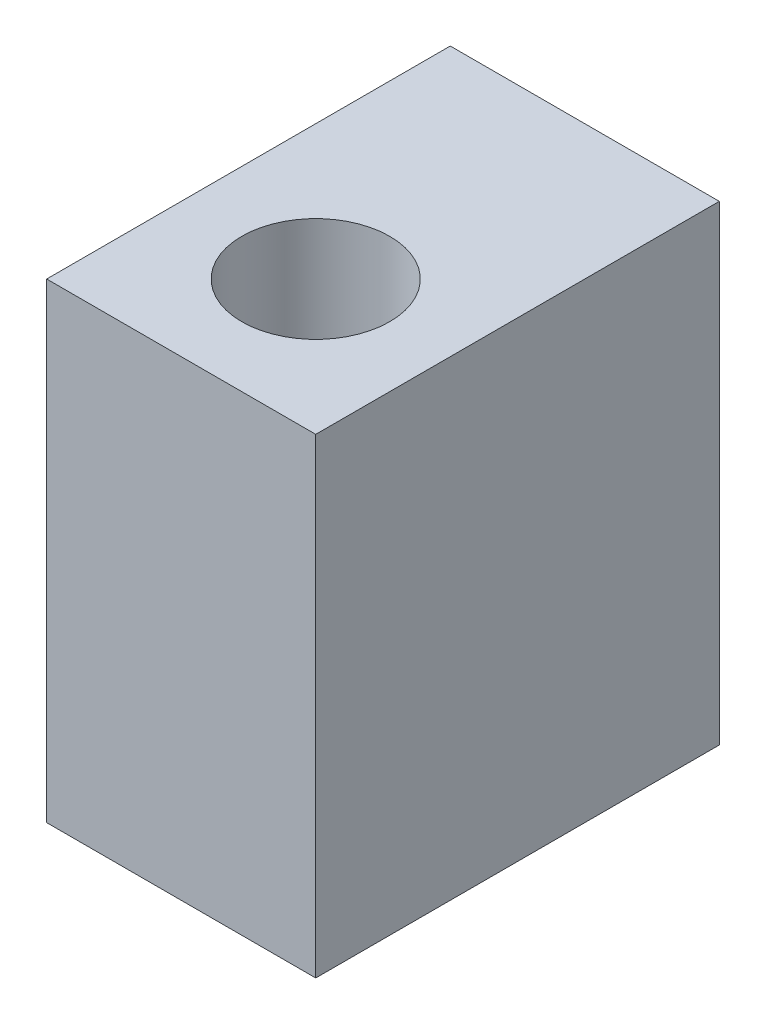
ISO-10303-21;
HEADER;
FILE_DESCRIPTION(('STEP AP214'),'2;1');
FILE_NAME('part.step','',(''),(''),'','','');
FILE_SCHEMA(('AUTOMOTIVE_DESIGN { 1 0 10303 214 1 1 1 1 }'));
ENDSEC;
DATA;
#1=APPLICATION_CONTEXT('core data for automotive mechanical design processes');
#2=APPLICATION_PROTOCOL_DEFINITION('international standard','automotive_design',2000,#1);
#3=PRODUCT_CONTEXT('',#1,'mechanical');
#4=PRODUCT('Part','Part','',(#3));
#5=PRODUCT_RELATED_PRODUCT_CATEGORY('part','',(#4));
#6=PRODUCT_DEFINITION_FORMATION('','',#4);
#7=PRODUCT_DEFINITION_CONTEXT('part definition',#1,'design');
#8=PRODUCT_DEFINITION('design','',#6,#7);
#9=PRODUCT_DEFINITION_SHAPE('','',#8);
#10=(LENGTH_UNIT() NAMED_UNIT(*) SI_UNIT(.MILLI.,.METRE.));
#11=(NAMED_UNIT(*) PLANE_ANGLE_UNIT() SI_UNIT($,.RADIAN.));
#12=(NAMED_UNIT(*) SI_UNIT($,.STERADIAN.) SOLID_ANGLE_UNIT());
#13=UNCERTAINTY_MEASURE_WITH_UNIT(LENGTH_MEASURE(1.E-05),#10,'distance_accuracy_value','');
#14=(GEOMETRIC_REPRESENTATION_CONTEXT(3) GLOBAL_UNCERTAINTY_ASSIGNED_CONTEXT((#13)) GLOBAL_UNIT_ASSIGNED_CONTEXT((#10,
#11,#12)) REPRESENTATION_CONTEXT('',''));
#15=CARTESIAN_POINT('',(0.,0.,0.));
#16=DIRECTION('',(0.,0.,1.));
#17=DIRECTION('',(1.,0.,0.));
#18=AXIS2_PLACEMENT_3D('',#15,#16,#17);
#19=CARTESIAN_POINT('',(-1.1875,7.,-0.9921875));
#20=DIRECTION('',(1.,0.,0.));
#21=DIRECTION('',(0.,0.,-1.));
#22=AXIS2_PLACEMENT_3D('',#19,#20,#21);
#23=PLANE('',#22);
#24=DIRECTION('',(0.,0.,1.));
#25=VECTOR('',#24,1.);
#26=CARTESIAN_POINT('',(-1.1875,0.,-0.9921875));
#27=LINE('',#26,#25);
#28=CARTESIAN_POINT('',(-1.1875,0.,-0.9921875));
#29=VERTEX_POINT('',#28);
#30=CARTESIAN_POINT('',(-1.1875,0.,5.0078125));
#31=VERTEX_POINT('',#30);
#32=EDGE_CURVE('E107',#29,#31,#27,.T.);
#33=ORIENTED_EDGE('',*,*,#32,.T.);
#34=DIRECTION('',(0.,-1.,0.));
#35=VECTOR('',#34,1.);
#36=CARTESIAN_POINT('',(-1.1875,7.,5.0078125));
#37=LINE('',#36,#35);
#38=CARTESIAN_POINT('',(-1.1875,7.,5.0078125));
#39=VERTEX_POINT('',#38);
#40=EDGE_CURVE('E11',#39,#31,#37,.T.);
#41=ORIENTED_EDGE('',*,*,#40,.F.);
#42=DIRECTION('',(0.,0.,1.));
#43=VECTOR('',#42,1.);
#44=CARTESIAN_POINT('',(-1.1875,7.,-0.9921875));
#45=LINE('',#44,#43);
#46=CARTESIAN_POINT('',(-1.1875,7.,-0.9921875));
#47=VERTEX_POINT('',#46);
#48=EDGE_CURVE('E91',#47,#39,#45,.T.);
#49=ORIENTED_EDGE('',*,*,#48,.F.);
#50=DIRECTION('',(0.,-1.,0.));
#51=VECTOR('',#50,1.);
#52=CARTESIAN_POINT('',(-1.1875,7.,-0.9921875));
#53=LINE('',#52,#51);
#54=EDGE_CURVE('E103',#47,#29,#53,.T.);
#55=ORIENTED_EDGE('',*,*,#54,.T.);
#56=EDGE_LOOP('',(#33,#41,#49,#55));
#57=FACE_BOUND('',#56,.T.);
#58=ADVANCED_FACE('F39',(#57),#23,.F.);
#59=CARTESIAN_POINT('',(-1.1875,7.,5.0078125));
#60=DIRECTION('',(0.,0.,-1.));
#61=DIRECTION('',(-1.,0.,0.));
#62=AXIS2_PLACEMENT_3D('',#59,#60,#61);
#63=PLANE('',#62);
#64=DIRECTION('',(1.,0.,0.));
#65=VECTOR('',#64,1.);
#66=CARTESIAN_POINT('',(-1.1875,0.,5.0078125));
#67=LINE('',#66,#65);
#68=CARTESIAN_POINT('',(2.8125,0.,5.0078125));
#69=VERTEX_POINT('',#68);
#70=EDGE_CURVE('E96',#31,#69,#67,.T.);
#71=ORIENTED_EDGE('',*,*,#70,.T.);
#72=DIRECTION('',(0.,-1.,0.));
#73=VECTOR('',#72,1.);
#74=CARTESIAN_POINT('',(2.8125,7.,5.0078125));
#75=LINE('',#74,#73);
#76=CARTESIAN_POINT('',(2.8125,7.,5.0078125));
#77=VERTEX_POINT('',#76);
#78=EDGE_CURVE('E48',#77,#69,#75,.T.);
#79=ORIENTED_EDGE('',*,*,#78,.F.);
#80=DIRECTION('',(1.,0.,0.));
#81=VECTOR('',#80,1.);
#82=CARTESIAN_POINT('',(-1.1875,7.,5.0078125));
#83=LINE('',#82,#81);
#84=EDGE_CURVE('E86',#39,#77,#83,.T.);
#85=ORIENTED_EDGE('',*,*,#84,.F.);
#86=ORIENTED_EDGE('',*,*,#40,.T.);
#87=EDGE_LOOP('',(#71,#79,#85,#86));
#88=FACE_BOUND('',#87,.T.);
#89=ADVANCED_FACE('F95',(#88),#63,.F.);
#90=CARTESIAN_POINT('',(2.8125,7.,-0.9921875));
#91=DIRECTION('',(-1.,0.,0.));
#92=DIRECTION('',(0.,0.,1.));
#93=AXIS2_PLACEMENT_3D('',#90,#91,#92);
#94=PLANE('',#93);
#95=DIRECTION('',(0.,0.,-1.));
#96=VECTOR('',#95,1.);
#97=CARTESIAN_POINT('',(2.8125,0.,-0.9921875));
#98=LINE('',#97,#96);
#99=CARTESIAN_POINT('',(2.8125,0.,-0.9921875));
#100=VERTEX_POINT('',#99);
#101=EDGE_CURVE('E73',#69,#100,#98,.T.);
#102=ORIENTED_EDGE('',*,*,#101,.T.);
#103=DIRECTION('',(0.,-1.,0.));
#104=VECTOR('',#103,1.);
#105=CARTESIAN_POINT('',(2.8125,7.,-0.9921875));
#106=LINE('',#105,#104);
#107=CARTESIAN_POINT('',(2.8125,7.,-0.9921875));
#108=VERTEX_POINT('',#107);
#109=EDGE_CURVE('E98',#108,#100,#106,.T.);
#110=ORIENTED_EDGE('',*,*,#109,.F.);
#111=DIRECTION('',(0.,0.,-1.));
#112=VECTOR('',#111,1.);
#113=CARTESIAN_POINT('',(2.8125,7.,-0.9921875));
#114=LINE('',#113,#112);
#115=EDGE_CURVE('E89',#77,#108,#114,.T.);
#116=ORIENTED_EDGE('',*,*,#115,.F.);
#117=ORIENTED_EDGE('',*,*,#78,.T.);
#118=EDGE_LOOP('',(#102,#110,#116,#117));
#119=FACE_BOUND('',#118,.T.);
#120=ADVANCED_FACE('F99',(#119),#94,.F.);
#121=CARTESIAN_POINT('',(-1.1875,7.,-0.9921875));
#122=DIRECTION('',(0.,0.,1.));
#123=DIRECTION('',(1.,0.,0.));
#124=AXIS2_PLACEMENT_3D('',#121,#122,#123);
#125=PLANE('',#124);
#126=DIRECTION('',(-1.,0.,0.));
#127=VECTOR('',#126,1.);
#128=CARTESIAN_POINT('',(-1.1875,0.,-0.9921875));
#129=LINE('',#128,#127);
#130=EDGE_CURVE('E79',#100,#29,#129,.T.);
#131=ORIENTED_EDGE('',*,*,#130,.T.);
#132=ORIENTED_EDGE('',*,*,#54,.F.);
#133=DIRECTION('',(-1.,0.,0.));
#134=VECTOR('',#133,1.);
#135=CARTESIAN_POINT('',(-1.1875,7.,-0.9921875));
#136=LINE('',#135,#134);
#137=EDGE_CURVE('E56',#108,#47,#136,.T.);
#138=ORIENTED_EDGE('',*,*,#137,.F.);
#139=ORIENTED_EDGE('',*,*,#109,.T.);
#140=EDGE_LOOP('',(#131,#132,#138,#139));
#141=FACE_BOUND('',#140,.T.);
#142=ADVANCED_FACE('F121',(#141),#125,.F.);
#143=CARTESIAN_POINT('',(0.,7.,0.));
#144=DIRECTION('',(0.,1.,0.));
#145=DIRECTION('',(0.,0.,1.));
#146=AXIS2_PLACEMENT_3D('',#143,#144,#145);
#147=PLANE('',#146);
#148=CARTESIAN_POINT('',(0.812499999999999,7.,3.0078125));
#149=DIRECTION('',(0.,-1.,0.));
#150=DIRECTION('',(0.,0.,-1.));
#151=AXIS2_PLACEMENT_3D('',#148,#149,#150);
#152=CIRCLE('',#151,1.1);
#153=CARTESIAN_POINT('',(0.812499999999999,7.,1.9078125));
#154=VERTEX_POINT('',#153);
#155=EDGE_CURVE('E111',#154,#154,#152,.T.);
#156=ORIENTED_EDGE('',*,*,#155,.T.);
#157=EDGE_LOOP('',(#156));
#158=FACE_BOUND('',#157,.T.);
#159=ORIENTED_EDGE('',*,*,#48,.T.);
#160=ORIENTED_EDGE('',*,*,#84,.T.);
#161=ORIENTED_EDGE('',*,*,#115,.T.);
#162=ORIENTED_EDGE('',*,*,#137,.T.);
#163=EDGE_LOOP('',(#159,#160,#161,#162));
#164=FACE_BOUND('',#163,.T.);
#165=ADVANCED_FACE('F87',(#158,#164),#147,.T.);
#166=CARTESIAN_POINT('',(0.,0.,0.));
#167=DIRECTION('',(0.,1.,0.));
#168=DIRECTION('',(0.,0.,1.));
#169=AXIS2_PLACEMENT_3D('',#166,#167,#168);
#170=PLANE('',#169);
#171=CARTESIAN_POINT('',(0.812499999999999,0.,3.0078125));
#172=DIRECTION('',(0.,-1.,0.));
#173=DIRECTION('',(0.,0.,-1.));
#174=AXIS2_PLACEMENT_3D('',#171,#172,#173);
#175=CIRCLE('',#174,1.1);
#176=CARTESIAN_POINT('',(0.812499999999999,0.,1.9078125));
#177=VERTEX_POINT('',#176);
#178=EDGE_CURVE('E128',#177,#177,#175,.T.);
#179=ORIENTED_EDGE('',*,*,#178,.F.);
#180=EDGE_LOOP('',(#179));
#181=FACE_BOUND('',#180,.T.);
#182=ORIENTED_EDGE('',*,*,#32,.F.);
#183=ORIENTED_EDGE('',*,*,#130,.F.);
#184=ORIENTED_EDGE('',*,*,#101,.F.);
#185=ORIENTED_EDGE('',*,*,#70,.F.);
#186=EDGE_LOOP('',(#182,#183,#184,#185));
#187=FACE_BOUND('',#186,.T.);
#188=ADVANCED_FACE('F124',(#181,#187),#170,.F.);
#189=CARTESIAN_POINT('',(0.812499999999999,7.,3.0078125));
#190=DIRECTION('',(0.,-1.,0.));
#191=DIRECTION('',(0.,0.,-1.));
#192=AXIS2_PLACEMENT_3D('',#189,#190,#191);
#193=CYLINDRICAL_SURFACE('',#192,1.1);
#194=ORIENTED_EDGE('',*,*,#155,.F.);
#195=EDGE_LOOP('',(#194));
#196=FACE_BOUND('',#195,.T.);
#197=ORIENTED_EDGE('',*,*,#178,.T.);
#198=EDGE_LOOP('',(#197));
#199=FACE_BOUND('',#198,.T.);
#200=ADVANCED_FACE('F137',(#196,#199),#193,.F.);
#201=CLOSED_SHELL('',(#58,#89,#120,#142,#165,#188,#200));
#202=MANIFOLD_SOLID_BREP('B2',#201);
#203=ADVANCED_BREP_SHAPE_REPRESENTATION('',(#18,#202),#14);
#204=SHAPE_DEFINITION_REPRESENTATION(#9,#203);
ENDSEC;
END-ISO-10303-21;
